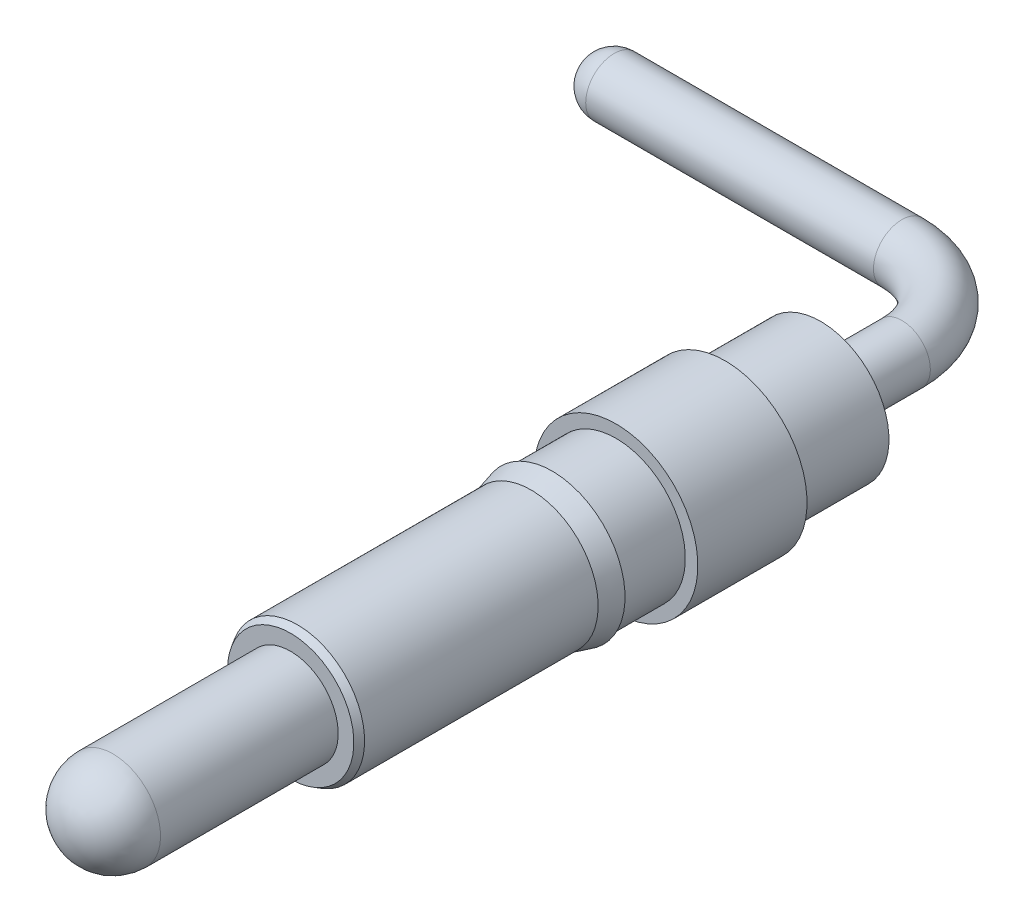
ISO-10303-21;
HEADER;
FILE_DESCRIPTION(('STEP AP214'),'2;1');
FILE_NAME('part.step','',(''),(''),'','','');
FILE_SCHEMA(('AUTOMOTIVE_DESIGN { 1 0 10303 214 1 1 1 1 }'));
ENDSEC;
DATA;
#1=APPLICATION_CONTEXT('core data for automotive mechanical design processes');
#2=APPLICATION_PROTOCOL_DEFINITION('international standard','automotive_design',2000,#1);
#3=PRODUCT_CONTEXT('',#1,'mechanical');
#4=PRODUCT('Part','Part','',(#3));
#5=PRODUCT_RELATED_PRODUCT_CATEGORY('part','',(#4));
#6=PRODUCT_DEFINITION_FORMATION('','',#4);
#7=PRODUCT_DEFINITION_CONTEXT('part definition',#1,'design');
#8=PRODUCT_DEFINITION('design','',#6,#7);
#9=PRODUCT_DEFINITION_SHAPE('','',#8);
#10=(LENGTH_UNIT() NAMED_UNIT(*) SI_UNIT(.MILLI.,.METRE.));
#11=(NAMED_UNIT(*) PLANE_ANGLE_UNIT() SI_UNIT($,.RADIAN.));
#12=(NAMED_UNIT(*) SI_UNIT($,.STERADIAN.) SOLID_ANGLE_UNIT());
#13=UNCERTAINTY_MEASURE_WITH_UNIT(LENGTH_MEASURE(1.E-05),#10,'distance_accuracy_value','');
#14=(GEOMETRIC_REPRESENTATION_CONTEXT(3) GLOBAL_UNCERTAINTY_ASSIGNED_CONTEXT((#13)) GLOBAL_UNIT_ASSIGNED_CONTEXT((#10,
#11,#12)) REPRESENTATION_CONTEXT('',''));
#15=CARTESIAN_POINT('',(0.,0.,0.));
#16=DIRECTION('',(0.,0.,1.));
#17=DIRECTION('',(1.,0.,0.));
#18=AXIS2_PLACEMENT_3D('',#15,#16,#17);
#19=CARTESIAN_POINT('',(0.,0.,0.));
#20=DIRECTION('',(-1.,0.,0.));
#21=DIRECTION('',(0.,0.,1.));
#22=AXIS2_PLACEMENT_3D('',#19,#20,#21);
#23=CYLINDRICAL_SURFACE('',#22,0.317499999999994);
#24=CARTESIAN_POINT('',(0.317500000000012,0.,0.));
#25=DIRECTION('',(-1.,0.,0.));
#26=DIRECTION('',(0.,0.,1.));
#27=AXIS2_PLACEMENT_3D('',#24,#25,#26);
#28=CIRCLE('',#27,0.317499999999994);
#29=CARTESIAN_POINT('',(0.317500000000012,0.,0.317499999999994));
#30=VERTEX_POINT('',#29);
#31=EDGE_CURVE('E115',#30,#30,#28,.T.);
#32=ORIENTED_EDGE('',*,*,#31,.F.);
#33=EDGE_LOOP('',(#32));
#34=FACE_BOUND('',#33,.T.);
#35=CARTESIAN_POINT('',(3.5306,0.,0.));
#36=DIRECTION('',(1.,0.,0.));
#37=DIRECTION('',(0.,1.,0.));
#38=AXIS2_PLACEMENT_3D('',#35,#36,#37);
#39=CIRCLE('',#38,0.317499999999994);
#40=CARTESIAN_POINT('',(3.5306,0.,-0.317499999999993));
#41=VERTEX_POINT('',#40);
#42=EDGE_CURVE('E132',#41,#41,#39,.T.);
#43=ORIENTED_EDGE('',*,*,#42,.F.);
#44=EDGE_LOOP('',(#43));
#45=FACE_BOUND('',#44,.T.);
#46=ADVANCED_FACE('F85',(#34,#45),#23,.T.);
#47=CARTESIAN_POINT('',(4.50565957575367,0.,-4.08716042424638));
#48=DIRECTION('',(0.,0.,-1.));
#49=DIRECTION('',(-1.,0.,0.));
#50=AXIS2_PLACEMENT_3D('',#47,#48,#49);
#51=CYLINDRICAL_SURFACE('',#50,0.761999999999985);
#52=CARTESIAN_POINT('',(4.50565957575366,0.,1.88183957575366));
#53=DIRECTION('',(0.,0.,-1.));
#54=DIRECTION('',(-1.,0.,0.));
#55=AXIS2_PLACEMENT_3D('',#52,#53,#54);
#56=CIRCLE('',#55,0.761999999999985);
#57=CARTESIAN_POINT('',(3.74365957575368,0.,1.88183957575366));
#58=VERTEX_POINT('',#57);
#59=EDGE_CURVE('E106',#58,#58,#56,.T.);
#60=ORIENTED_EDGE('',*,*,#59,.F.);
#61=EDGE_LOOP('',(#60));
#62=FACE_BOUND('',#61,.T.);
#63=CARTESIAN_POINT('',(4.50565957575366,0.,2.94863957575364));
#64=DIRECTION('',(0.,0.,-1.));
#65=DIRECTION('',(-1.,0.,0.));
#66=AXIS2_PLACEMENT_3D('',#63,#64,#65);
#67=CIRCLE('',#66,0.761999999999985);
#68=CARTESIAN_POINT('',(3.74365957575367,0.,2.94863957575364));
#69=VERTEX_POINT('',#68);
#70=EDGE_CURVE('E12',#69,#69,#67,.T.);
#71=ORIENTED_EDGE('',*,*,#70,.T.);
#72=EDGE_LOOP('',(#71));
#73=FACE_BOUND('',#72,.T.);
#74=ADVANCED_FACE('F176',(#62,#73),#51,.T.);
#75=CARTESIAN_POINT('',(4.50565957575367,0.,-4.08716042424638));
#76=DIRECTION('',(0.,0.,-1.));
#77=DIRECTION('',(-1.,0.,0.));
#78=AXIS2_PLACEMENT_3D('',#75,#76,#77);
#79=CYLINDRICAL_SURFACE('',#78,0.914399999999954);
#80=CARTESIAN_POINT('',(4.50565957575366,0.,2.94863957575364));
#81=DIRECTION('',(0.,0.,-1.));
#82=DIRECTION('',(-1.,0.,0.));
#83=AXIS2_PLACEMENT_3D('',#80,#81,#82);
#84=CIRCLE('',#83,0.914399999999954);
#85=CARTESIAN_POINT('',(3.5912595757537,0.,2.94863957575364));
#86=VERTEX_POINT('',#85);
#87=EDGE_CURVE('E109',#86,#86,#84,.T.);
#88=ORIENTED_EDGE('',*,*,#87,.F.);
#89=EDGE_LOOP('',(#88));
#90=FACE_BOUND('',#89,.T.);
#91=CARTESIAN_POINT('',(4.50565957575366,0.,4.16783957575364));
#92=DIRECTION('',(0.,0.,-1.));
#93=DIRECTION('',(-1.,0.,0.));
#94=AXIS2_PLACEMENT_3D('',#91,#92,#93);
#95=CIRCLE('',#94,0.914399999999954);
#96=CARTESIAN_POINT('',(3.5912595757537,0.,4.16783957575364));
#97=VERTEX_POINT('',#96);
#98=EDGE_CURVE('E93',#97,#97,#95,.T.);
#99=ORIENTED_EDGE('',*,*,#98,.T.);
#100=EDGE_LOOP('',(#99));
#101=FACE_BOUND('',#100,.T.);
#102=ADVANCED_FACE('F172',(#90,#101),#79,.T.);
#103=CARTESIAN_POINT('',(4.50565957575367,0.,-4.08716042424638));
#104=DIRECTION('',(0.,0.,-1.));
#105=DIRECTION('',(-1.,0.,0.));
#106=AXIS2_PLACEMENT_3D('',#103,#104,#105);
#107=CYLINDRICAL_SURFACE('',#106,0.774699999999962);
#108=CARTESIAN_POINT('',(4.50565957575366,0.,4.16783957575364));
#109=DIRECTION('',(0.,0.,-1.));
#110=DIRECTION('',(-1.,0.,0.));
#111=AXIS2_PLACEMENT_3D('',#108,#109,#110);
#112=CIRCLE('',#111,0.774699999999962);
#113=CARTESIAN_POINT('',(3.7309595757537,0.,4.16783957575364));
#114=VERTEX_POINT('',#113);
#115=EDGE_CURVE('E155',#114,#114,#112,.T.);
#116=ORIENTED_EDGE('',*,*,#115,.F.);
#117=EDGE_LOOP('',(#116));
#118=FACE_BOUND('',#117,.T.);
#119=CARTESIAN_POINT('',(4.50565957575366,0.,4.87903957575368));
#120=DIRECTION('',(0.,0.,-1.));
#121=DIRECTION('',(-1.,0.,0.));
#122=AXIS2_PLACEMENT_3D('',#119,#120,#121);
#123=CIRCLE('',#122,0.774699999999961);
#124=CARTESIAN_POINT('',(3.73095957575369,0.,4.87903957575368));
#125=VERTEX_POINT('',#124);
#126=EDGE_CURVE('E98',#125,#125,#123,.T.);
#127=ORIENTED_EDGE('',*,*,#126,.T.);
#128=EDGE_LOOP('',(#127));
#129=FACE_BOUND('',#128,.T.);
#130=ADVANCED_FACE('F175',(#118,#129),#107,.T.);
#131=CARTESIAN_POINT('',(4.50565957575366,0.,5.11602480203445));
#132=DIRECTION('',(0.,0.,-1.));
#133=DIRECTION('',(-1.,0.,0.));
#134=AXIS2_PLACEMENT_3D('',#131,#132,#133);
#135=CONICAL_SURFACE('',#134,0.749299999999953,0.261799387799192);
#136=CARTESIAN_POINT('',(4.50565957575366,0.,4.87903957575368));
#137=DIRECTION('',(0.,0.,-1.));
#138=DIRECTION('',(-1.,0.,0.));
#139=AXIS2_PLACEMENT_3D('',#136,#137,#138);
#140=CIRCLE('',#139,0.812800000000003);
#141=CARTESIAN_POINT('',(3.69285957575365,0.,4.87903957575368));
#142=VERTEX_POINT('',#141);
#143=EDGE_CURVE('E139',#142,#142,#140,.T.);
#144=ORIENTED_EDGE('',*,*,#143,.F.);
#145=EDGE_LOOP('',(#144));
#146=FACE_BOUND('',#145,.T.);
#147=CARTESIAN_POINT('',(4.50565957575366,0.,5.11602480203445));
#148=DIRECTION('',(0.,0.,-1.));
#149=DIRECTION('',(-1.,0.,0.));
#150=AXIS2_PLACEMENT_3D('',#147,#148,#149);
#151=CIRCLE('',#150,0.749299999999953);
#152=CARTESIAN_POINT('',(3.7563595757537,0.,5.11602480203445));
#153=VERTEX_POINT('',#152);
#154=EDGE_CURVE('E146',#153,#153,#151,.T.);
#155=ORIENTED_EDGE('',*,*,#154,.T.);
#156=EDGE_LOOP('',(#155));
#157=FACE_BOUND('',#156,.T.);
#158=ADVANCED_FACE('F189',(#146,#157),#135,.T.);
#159=CARTESIAN_POINT('',(4.50565957575367,0.,-4.08716042424638));
#160=DIRECTION('',(0.,0.,-1.));
#161=DIRECTION('',(-1.,0.,0.));
#162=AXIS2_PLACEMENT_3D('',#159,#160,#161);
#163=CYLINDRICAL_SURFACE('',#162,0.749299999999953);
#164=ORIENTED_EDGE('',*,*,#154,.F.);
#165=EDGE_LOOP('',(#164));
#166=FACE_BOUND('',#165,.T.);
#167=CARTESIAN_POINT('',(4.50565957575365,0.,7.72383957575362));
#168=DIRECTION('',(0.,0.,-1.));
#169=DIRECTION('',(-1.,0.,0.));
#170=AXIS2_PLACEMENT_3D('',#167,#168,#169);
#171=CIRCLE('',#170,0.749299999999953);
#172=CARTESIAN_POINT('',(3.7563595757537,0.,7.72383957575362));
#173=VERTEX_POINT('',#172);
#174=EDGE_CURVE('E128',#173,#173,#171,.T.);
#175=ORIENTED_EDGE('',*,*,#174,.T.);
#176=EDGE_LOOP('',(#175));
#177=FACE_BOUND('',#176,.T.);
#178=ADVANCED_FACE('F201',(#166,#177),#163,.T.);
#179=CARTESIAN_POINT('',(4.50565957575365,0.,7.80003957575366));
#180=DIRECTION('',(0.,0.,-1.));
#181=DIRECTION('',(-1.,0.,0.));
#182=AXIS2_PLACEMENT_3D('',#179,#180,#181);
#183=CONICAL_SURFACE('',#182,0.705305909487668,0.523598775598408);
#184=ORIENTED_EDGE('',*,*,#174,.F.);
#185=EDGE_LOOP('',(#184));
#186=FACE_BOUND('',#185,.T.);
#187=CARTESIAN_POINT('',(4.50565957575365,0.,7.80003957575366));
#188=DIRECTION('',(0.,0.,-1.));
#189=DIRECTION('',(-1.,0.,0.));
#190=AXIS2_PLACEMENT_3D('',#187,#188,#189);
#191=CIRCLE('',#190,0.705305909487668);
#192=CARTESIAN_POINT('',(3.80035366626598,0.,7.80003957575366));
#193=VERTEX_POINT('',#192);
#194=EDGE_CURVE('E123',#193,#193,#191,.T.);
#195=ORIENTED_EDGE('',*,*,#194,.T.);
#196=EDGE_LOOP('',(#195));
#197=FACE_BOUND('',#196,.T.);
#198=ADVANCED_FACE('F207',(#186,#197),#183,.T.);
#199=CARTESIAN_POINT('',(4.50565957575367,0.,-4.08716042424638));
#200=DIRECTION('',(0.,0.,-1.));
#201=DIRECTION('',(-1.,0.,0.));
#202=AXIS2_PLACEMENT_3D('',#199,#200,#201);
#203=CYLINDRICAL_SURFACE('',#202,0.530859999999967);
#204=CARTESIAN_POINT('',(4.50565957575365,0.,7.80003957575366));
#205=DIRECTION('',(0.,0.,-1.));
#206=DIRECTION('',(-1.,0.,0.));
#207=AXIS2_PLACEMENT_3D('',#204,#205,#206);
#208=CIRCLE('',#207,0.530859999999967);
#209=CARTESIAN_POINT('',(3.97479957575368,0.,7.80003957575366));
#210=VERTEX_POINT('',#209);
#211=EDGE_CURVE('E136',#210,#210,#208,.T.);
#212=ORIENTED_EDGE('',*,*,#211,.F.);
#213=EDGE_LOOP('',(#212));
#214=FACE_BOUND('',#213,.T.);
#215=CARTESIAN_POINT('',(4.50565957575365,0.,9.78377957575367));
#216=DIRECTION('',(0.,0.,-1.));
#217=DIRECTION('',(-1.,0.,0.));
#218=AXIS2_PLACEMENT_3D('',#215,#216,#217);
#219=CIRCLE('',#218,0.530859999999967);
#220=CARTESIAN_POINT('',(3.97479957575368,0.,9.78377957575367));
#221=VERTEX_POINT('',#220);
#222=EDGE_CURVE('E119',#221,#221,#219,.T.);
#223=ORIENTED_EDGE('',*,*,#222,.T.);
#224=EDGE_LOOP('',(#223));
#225=FACE_BOUND('',#224,.T.);
#226=ADVANCED_FACE('F213',(#214,#225),#203,.T.);
#227=CARTESIAN_POINT('',(4.50565957575365,0.,9.78377957575367));
#228=DIRECTION('',(0.,0.,-1.));
#229=DIRECTION('',(0.,1.,0.));
#230=AXIS2_PLACEMENT_3D('',#227,#228,#229);
#231=SPHERICAL_SURFACE('',#230,0.530859999999994);
#232=ORIENTED_EDGE('',*,*,#222,.F.);
#233=EDGE_LOOP('',(#232));
#234=FACE_BOUND('',#233,.T.);
#235=ADVANCED_FACE('F224',(#234),#231,.T.);
#236=CARTESIAN_POINT('',(0.317500000000012,0.,0.));
#237=DIRECTION('',(-1.,0.,0.));
#238=DIRECTION('',(0.,1.,0.));
#239=AXIS2_PLACEMENT_3D('',#236,#237,#238);
#240=SPHERICAL_SURFACE('',#239,0.317500000000012);
#241=ORIENTED_EDGE('',*,*,#31,.T.);
#242=EDGE_LOOP('',(#241));
#243=FACE_BOUND('',#242,.T.);
#244=ADVANCED_FACE('F229',(#243),#240,.T.);
#245=CARTESIAN_POINT('',(3.5306,0.,0.975059575753662));
#246=DIRECTION('',(0.,-1.,0.));
#247=DIRECTION('',(0.,0.,-1.));
#248=AXIS2_PLACEMENT_3D('',#245,#246,#247);
#249=TOROIDAL_SURFACE('',#248,0.975059575753662,0.317499999999994);
#250=CARTESIAN_POINT('',(4.50565957575366,0.,0.975059575753664));
#251=DIRECTION('',(0.,0.,1.));
#252=DIRECTION('',(0.,1.,0.));
#253=AXIS2_PLACEMENT_3D('',#250,#251,#252);
#254=CIRCLE('',#253,0.317499999999994);
#255=CARTESIAN_POINT('',(4.82315957575365,0.,0.975059575753665));
#256=VERTEX_POINT('',#255);
#257=EDGE_CURVE('E116',#256,#256,#254,.T.);
#258=CARTESIAN_POINT('',(3.5306,0.,0.975059575753662));
#259=DIRECTION('',(0.,-1.,0.));
#260=DIRECTION('',(0.,0.,-1.));
#261=AXIS2_PLACEMENT_3D('',#258,#259,#260);
#262=CIRCLE('',#261,1.29255957575366);
#263=EDGE_CURVE('',#41,#256,#262,.T.);
#264=ORIENTED_EDGE('',*,*,#42,.T.);
#265=ORIENTED_EDGE('',*,*,#257,.F.);
#266=ORIENTED_EDGE('',*,*,#263,.T.);
#267=ORIENTED_EDGE('',*,*,#263,.F.);
#268=EDGE_LOOP('',(#264,#266,#265,#267));
#269=FACE_BOUND('',#268,.T.);
#270=ADVANCED_FACE('F249',(#269),#249,.T.);
#271=CARTESIAN_POINT('',(4.50565957575367,0.,-4.08716042424638));
#272=DIRECTION('',(0.,0.,-1.));
#273=DIRECTION('',(-1.,0.,0.));
#274=AXIS2_PLACEMENT_3D('',#271,#272,#273);
#275=CYLINDRICAL_SURFACE('',#274,0.317499999999994);
#276=ORIENTED_EDGE('',*,*,#257,.T.);
#277=EDGE_LOOP('',(#276));
#278=FACE_BOUND('',#277,.T.);
#279=CARTESIAN_POINT('',(4.50565957575366,0.,1.88183957575366));
#280=DIRECTION('',(0.,0.,-1.));
#281=DIRECTION('',(-1.,0.,0.));
#282=AXIS2_PLACEMENT_3D('',#279,#280,#281);
#283=CIRCLE('',#282,0.317499999999994);
#284=CARTESIAN_POINT('',(4.18815957575367,0.,1.88183957575366));
#285=VERTEX_POINT('',#284);
#286=EDGE_CURVE('E112',#285,#285,#283,.T.);
#287=ORIENTED_EDGE('',*,*,#286,.T.);
#288=EDGE_LOOP('',(#287));
#289=FACE_BOUND('',#288,.T.);
#290=ADVANCED_FACE('F219',(#278,#289),#275,.T.);
#291=CARTESIAN_POINT('',(4.50565957575365,0.705305909487642,7.80003957575367));
#292=DIRECTION('',(0.,0.,-1.));
#293=DIRECTION('',(-1.,0.,0.));
#294=AXIS2_PLACEMENT_3D('',#291,#292,#293);
#295=PLANE('',#294);
#296=ORIENTED_EDGE('',*,*,#194,.F.);
#297=EDGE_LOOP('',(#296));
#298=FACE_BOUND('',#297,.T.);
#299=ORIENTED_EDGE('',*,*,#211,.T.);
#300=EDGE_LOOP('',(#299));
#301=FACE_BOUND('',#300,.T.);
#302=ADVANCED_FACE('F195',(#298,#301),#295,.F.);
#303=CARTESIAN_POINT('',(4.50565957575366,0.774699999999945,4.87903957575368));
#304=DIRECTION('',(0.,0.,1.));
#305=DIRECTION('',(1.,0.,0.));
#306=AXIS2_PLACEMENT_3D('',#303,#304,#305);
#307=PLANE('',#306);
#308=ORIENTED_EDGE('',*,*,#126,.F.);
#309=EDGE_LOOP('',(#308));
#310=FACE_BOUND('',#309,.T.);
#311=ORIENTED_EDGE('',*,*,#143,.T.);
#312=EDGE_LOOP('',(#311));
#313=FACE_BOUND('',#312,.T.);
#314=ADVANCED_FACE('F183',(#310,#313),#307,.F.);
#315=CARTESIAN_POINT('',(4.50565957575366,0.91439999999994,4.16783957575365));
#316=DIRECTION('',(0.,0.,-1.));
#317=DIRECTION('',(-1.,0.,0.));
#318=AXIS2_PLACEMENT_3D('',#315,#316,#317);
#319=PLANE('',#318);
#320=ORIENTED_EDGE('',*,*,#98,.F.);
#321=EDGE_LOOP('',(#320));
#322=FACE_BOUND('',#321,.T.);
#323=ORIENTED_EDGE('',*,*,#115,.T.);
#324=EDGE_LOOP('',(#323));
#325=FACE_BOUND('',#324,.T.);
#326=ADVANCED_FACE('F180',(#322,#325),#319,.F.);
#327=CARTESIAN_POINT('',(4.50565957575366,0.761999999999975,2.94863957575364));
#328=DIRECTION('',(0.,0.,1.));
#329=DIRECTION('',(1.,0.,0.));
#330=AXIS2_PLACEMENT_3D('',#327,#328,#329);
#331=PLANE('',#330);
#332=ORIENTED_EDGE('',*,*,#70,.F.);
#333=EDGE_LOOP('',(#332));
#334=FACE_BOUND('',#333,.T.);
#335=ORIENTED_EDGE('',*,*,#87,.T.);
#336=EDGE_LOOP('',(#335));
#337=FACE_BOUND('',#336,.T.);
#338=ADVANCED_FACE('F170',(#334,#337),#331,.F.);
#339=CARTESIAN_POINT('',(4.50565957575366,0.317499999999987,1.88183957575366));
#340=DIRECTION('',(0.,0.,1.));
#341=DIRECTION('',(1.,0.,0.));
#342=AXIS2_PLACEMENT_3D('',#339,#340,#341);
#343=PLANE('',#342);
#344=ORIENTED_EDGE('',*,*,#286,.F.);
#345=EDGE_LOOP('',(#344));
#346=FACE_BOUND('',#345,.T.);
#347=ORIENTED_EDGE('',*,*,#59,.T.);
#348=EDGE_LOOP('',(#347));
#349=FACE_BOUND('',#348,.T.);
#350=ADVANCED_FACE('F87',(#346,#349),#343,.F.);
#351=CLOSED_SHELL('',(#46,#74,#102,#130,#158,#178,#198,#226,#235,#244,#270,#290,#302,#314,#326,
#338,#350));
#352=MANIFOLD_SOLID_BREP('B2',#351);
#353=ADVANCED_BREP_SHAPE_REPRESENTATION('',(#18,#352),#14);
#354=SHAPE_DEFINITION_REPRESENTATION(#9,#353);
ENDSEC;
END-ISO-10303-21;
